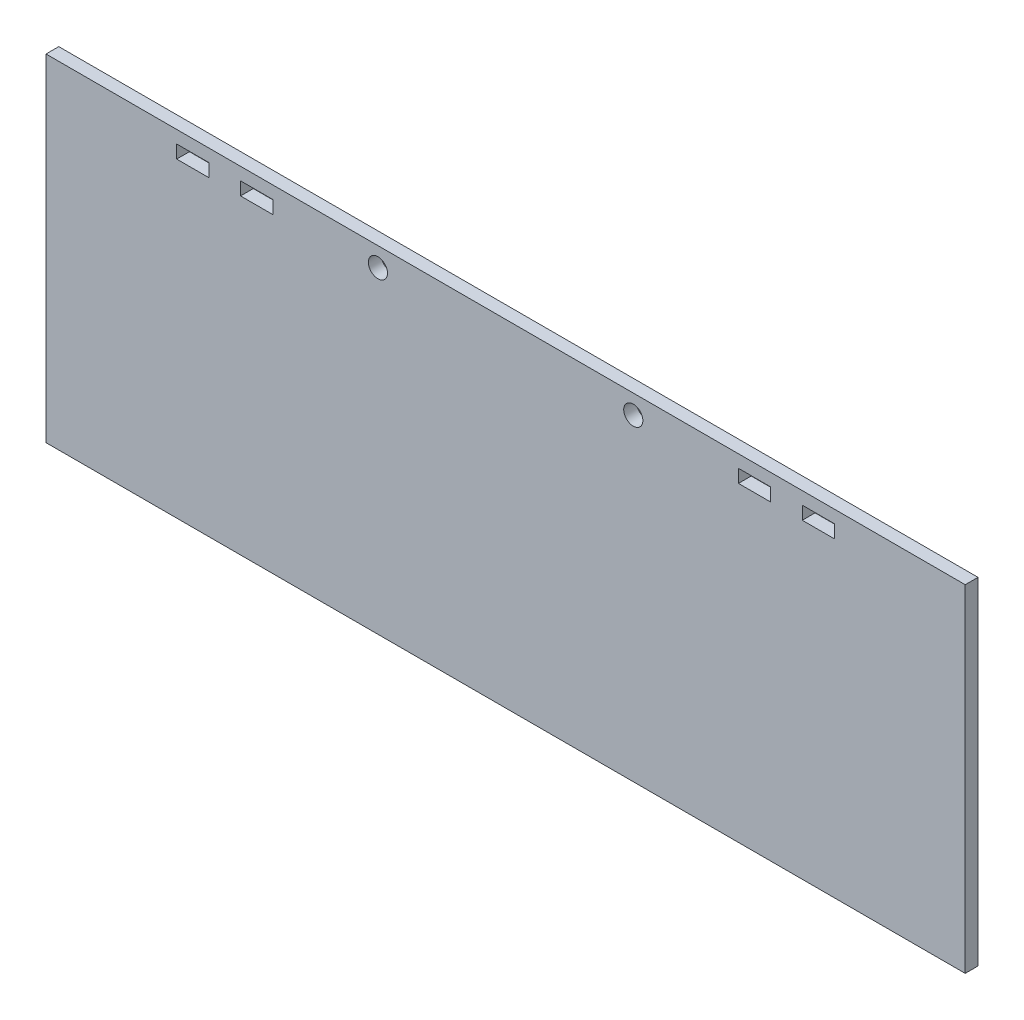
ISO-10303-21;
HEADER;
FILE_DESCRIPTION(('STEP AP214'),'2;1');
FILE_NAME('part.step','',(''),(''),'','','');
FILE_SCHEMA(('AUTOMOTIVE_DESIGN { 1 0 10303 214 1 1 1 1 }'));
ENDSEC;
DATA;
#1=APPLICATION_CONTEXT('core data for automotive mechanical design processes');
#2=APPLICATION_PROTOCOL_DEFINITION('international standard','automotive_design',2000,#1);
#3=PRODUCT_CONTEXT('',#1,'mechanical');
#4=PRODUCT('Part','Part','',(#3));
#5=PRODUCT_RELATED_PRODUCT_CATEGORY('part','',(#4));
#6=PRODUCT_DEFINITION_FORMATION('','',#4);
#7=PRODUCT_DEFINITION_CONTEXT('part definition',#1,'design');
#8=PRODUCT_DEFINITION('design','',#6,#7);
#9=PRODUCT_DEFINITION_SHAPE('','',#8);
#10=(LENGTH_UNIT() NAMED_UNIT(*) SI_UNIT(.MILLI.,.METRE.));
#11=(NAMED_UNIT(*) PLANE_ANGLE_UNIT() SI_UNIT($,.RADIAN.));
#12=(NAMED_UNIT(*) SI_UNIT($,.STERADIAN.) SOLID_ANGLE_UNIT());
#13=UNCERTAINTY_MEASURE_WITH_UNIT(LENGTH_MEASURE(1.E-05),#10,'distance_accuracy_value','');
#14=(GEOMETRIC_REPRESENTATION_CONTEXT(3) GLOBAL_UNCERTAINTY_ASSIGNED_CONTEXT((#13)) GLOBAL_UNIT_ASSIGNED_CONTEXT((#10,
#11,#12)) REPRESENTATION_CONTEXT('',''));
#15=CARTESIAN_POINT('',(0.,0.,0.));
#16=DIRECTION('',(0.,0.,1.));
#17=DIRECTION('',(1.,0.,0.));
#18=AXIS2_PLACEMENT_3D('',#15,#16,#17);
#19=CARTESIAN_POINT('',(0.,0.,2.));
#20=DIRECTION('',(0.,0.,1.));
#21=DIRECTION('',(1.,0.,0.));
#22=AXIS2_PLACEMENT_3D('',#19,#20,#21);
#23=PLANE('',#22);
#24=DIRECTION('',(-1.,0.,0.));
#25=VECTOR('',#24,1.);
#26=CARTESIAN_POINT('',(95.8,0.,2.));
#27=LINE('',#26,#25);
#28=CARTESIAN_POINT('',(95.8,0.,2.));
#29=VERTEX_POINT('',#28);
#30=CARTESIAN_POINT('',(90.75,0.,2.));
#31=VERTEX_POINT('',#30);
#32=EDGE_CURVE('E181',#29,#31,#27,.T.);
#33=ORIENTED_EDGE('',*,*,#32,.F.);
#34=DIRECTION('',(0.,1.,0.));
#35=VECTOR('',#34,1.);
#36=CARTESIAN_POINT('',(95.8,0.,2.));
#37=LINE('',#36,#35);
#38=CARTESIAN_POINT('',(95.8,-2.04999999999999,2.));
#39=VERTEX_POINT('',#38);
#40=EDGE_CURVE('E173',#39,#29,#37,.T.);
#41=ORIENTED_EDGE('',*,*,#40,.F.);
#42=DIRECTION('',(1.,0.,0.));
#43=VECTOR('',#42,1.);
#44=CARTESIAN_POINT('',(95.8,-2.04999999999999,2.));
#45=LINE('',#44,#43);
#46=CARTESIAN_POINT('',(90.75,-2.04999999999999,2.));
#47=VERTEX_POINT('',#46);
#48=EDGE_CURVE('E196',#47,#39,#45,.T.);
#49=ORIENTED_EDGE('',*,*,#48,.F.);
#50=DIRECTION('',(0.,-1.,0.));
#51=VECTOR('',#50,1.);
#52=CARTESIAN_POINT('',(90.75,0.,2.));
#53=LINE('',#52,#51);
#54=EDGE_CURVE('E194',#31,#47,#53,.T.);
#55=ORIENTED_EDGE('',*,*,#54,.F.);
#56=EDGE_LOOP('',(#33,#41,#49,#55));
#57=FACE_BOUND('',#56,.T.);
#58=CARTESIAN_POINT('',(34.275,-1.02499999999999,2.));
#59=DIRECTION('',(0.,0.,1.));
#60=DIRECTION('',(1.,0.,0.));
#61=AXIS2_PLACEMENT_3D('',#58,#59,#60);
#62=CIRCLE('',#61,1.5);
#63=CARTESIAN_POINT('',(35.775,-1.02499999999999,2.));
#64=VERTEX_POINT('',#63);
#65=EDGE_CURVE('E212',#64,#64,#62,.T.);
#66=ORIENTED_EDGE('',*,*,#65,.F.);
#67=EDGE_LOOP('',(#66));
#68=FACE_BOUND('',#67,.T.);
#69=DIRECTION('',(-1.,0.,0.));
#70=VECTOR('',#69,1.);
#71=CARTESIAN_POINT('',(54.2768532390721,1.97309279806744,2.));
#72=LINE('',#71,#70);
#73=CARTESIAN_POINT('',(126.276853239072,1.97309279806744,2.));
#74=VERTEX_POINT('',#73);
#75=CARTESIAN_POINT('',(-17.7231467609279,1.97309279806744,2.));
#76=VERTEX_POINT('',#75);
#77=EDGE_CURVE('E311',#74,#76,#72,.T.);
#78=ORIENTED_EDGE('',*,*,#77,.T.);
#79=DIRECTION('',(0.,-1.,0.));
#80=VECTOR('',#79,1.);
#81=CARTESIAN_POINT('',(-17.7231467609279,1.97309279806744,2.));
#82=LINE('',#81,#80);
#83=CARTESIAN_POINT('',(-17.7231467609279,-50.7609146083273,2.));
#84=VERTEX_POINT('',#83);
#85=EDGE_CURVE('E314',#76,#84,#82,.T.);
#86=ORIENTED_EDGE('',*,*,#85,.T.);
#87=DIRECTION('',(1.,0.,0.));
#88=VECTOR('',#87,1.);
#89=CARTESIAN_POINT('',(-17.7231467609279,-50.7609146083273,2.));
#90=LINE('',#89,#88);
#91=CARTESIAN_POINT('',(126.276853239072,-50.7609146083273,2.));
#92=VERTEX_POINT('',#91);
#93=EDGE_CURVE('E317',#84,#92,#90,.T.);
#94=ORIENTED_EDGE('',*,*,#93,.T.);
#95=DIRECTION('',(0.,1.,0.));
#96=VECTOR('',#95,1.);
#97=CARTESIAN_POINT('',(126.276853239072,1.97309279806744,2.));
#98=LINE('',#97,#96);
#99=EDGE_CURVE('E319',#92,#74,#98,.T.);
#100=ORIENTED_EDGE('',*,*,#99,.T.);
#101=EDGE_LOOP('',(#78,#86,#94,#100));
#102=FACE_BOUND('',#101,.T.);
#103=DIRECTION('',(-1.,0.,0.));
#104=VECTOR('',#103,1.);
#105=CARTESIAN_POINT('',(2.75000000000001,0.,2.));
#106=LINE('',#105,#104);
#107=CARTESIAN_POINT('',(7.80000000000001,0.,2.));
#108=VERTEX_POINT('',#107);
#109=CARTESIAN_POINT('',(2.75000000000001,0.,2.));
#110=VERTEX_POINT('',#109);
#111=EDGE_CURVE('E282',#108,#110,#106,.T.);
#112=ORIENTED_EDGE('',*,*,#111,.F.);
#113=DIRECTION('',(0.,1.,0.));
#114=VECTOR('',#113,1.);
#115=CARTESIAN_POINT('',(7.80000000000001,0.,2.));
#116=LINE('',#115,#114);
#117=CARTESIAN_POINT('',(7.80000000000001,-2.04999999999999,2.));
#118=VERTEX_POINT('',#117);
#119=EDGE_CURVE('E280',#118,#108,#116,.T.);
#120=ORIENTED_EDGE('',*,*,#119,.F.);
#121=DIRECTION('',(1.,0.,0.));
#122=VECTOR('',#121,1.);
#123=CARTESIAN_POINT('',(2.75000000000001,-2.04999999999999,2.));
#124=LINE('',#123,#122);
#125=CARTESIAN_POINT('',(2.75000000000001,-2.04999999999999,2.));
#126=VERTEX_POINT('',#125);
#127=EDGE_CURVE('E288',#126,#118,#124,.T.);
#128=ORIENTED_EDGE('',*,*,#127,.F.);
#129=DIRECTION('',(0.,-1.,0.));
#130=VECTOR('',#129,1.);
#131=CARTESIAN_POINT('',(2.75000000000001,0.,2.));
#132=LINE('',#131,#130);
#133=EDGE_CURVE('E285',#110,#126,#132,.T.);
#134=ORIENTED_EDGE('',*,*,#133,.F.);
#135=EDGE_LOOP('',(#112,#120,#128,#134));
#136=FACE_BOUND('',#135,.T.);
#137=DIRECTION('',(-1.,0.,0.));
#138=VECTOR('',#137,1.);
#139=CARTESIAN_POINT('',(12.75,0.,2.));
#140=LINE('',#139,#138);
#141=CARTESIAN_POINT('',(17.8,0.,2.));
#142=VERTEX_POINT('',#141);
#143=CARTESIAN_POINT('',(12.75,0.,2.));
#144=VERTEX_POINT('',#143);
#145=EDGE_CURVE('E251',#142,#144,#140,.T.);
#146=ORIENTED_EDGE('',*,*,#145,.F.);
#147=DIRECTION('',(0.,1.,0.));
#148=VECTOR('',#147,1.);
#149=CARTESIAN_POINT('',(17.8,0.,2.));
#150=LINE('',#149,#148);
#151=CARTESIAN_POINT('',(17.8,-2.04999999999999,2.));
#152=VERTEX_POINT('',#151);
#153=EDGE_CURVE('E249',#152,#142,#150,.T.);
#154=ORIENTED_EDGE('',*,*,#153,.F.);
#155=DIRECTION('',(1.,0.,0.));
#156=VECTOR('',#155,1.);
#157=CARTESIAN_POINT('',(12.75,-2.04999999999999,2.));
#158=LINE('',#157,#156);
#159=CARTESIAN_POINT('',(12.75,-2.04999999999999,2.));
#160=VERTEX_POINT('',#159);
#161=EDGE_CURVE('E257',#160,#152,#158,.T.);
#162=ORIENTED_EDGE('',*,*,#161,.F.);
#163=DIRECTION('',(0.,-1.,0.));
#164=VECTOR('',#163,1.);
#165=CARTESIAN_POINT('',(12.75,0.,2.));
#166=LINE('',#165,#164);
#167=EDGE_CURVE('E254',#144,#160,#166,.T.);
#168=ORIENTED_EDGE('',*,*,#167,.F.);
#169=EDGE_LOOP('',(#146,#154,#162,#168));
#170=FACE_BOUND('',#169,.T.);
#171=DIRECTION('',(-1.,0.,0.));
#172=VECTOR('',#171,1.);
#173=CARTESIAN_POINT('',(105.8,0.,2.));
#174=LINE('',#173,#172);
#175=CARTESIAN_POINT('',(105.8,0.,2.));
#176=VERTEX_POINT('',#175);
#177=CARTESIAN_POINT('',(100.75,0.,2.));
#178=VERTEX_POINT('',#177);
#179=EDGE_CURVE('E220',#176,#178,#174,.T.);
#180=ORIENTED_EDGE('',*,*,#179,.F.);
#181=DIRECTION('',(0.,1.,0.));
#182=VECTOR('',#181,1.);
#183=CARTESIAN_POINT('',(105.8,0.,2.));
#184=LINE('',#183,#182);
#185=CARTESIAN_POINT('',(105.8,-2.04999999999999,2.));
#186=VERTEX_POINT('',#185);
#187=EDGE_CURVE('E218',#186,#176,#184,.T.);
#188=ORIENTED_EDGE('',*,*,#187,.F.);
#189=DIRECTION('',(1.,0.,0.));
#190=VECTOR('',#189,1.);
#191=CARTESIAN_POINT('',(105.8,-2.04999999999999,2.));
#192=LINE('',#191,#190);
#193=CARTESIAN_POINT('',(100.75,-2.04999999999999,2.));
#194=VERTEX_POINT('',#193);
#195=EDGE_CURVE('E226',#194,#186,#192,.T.);
#196=ORIENTED_EDGE('',*,*,#195,.F.);
#197=DIRECTION('',(0.,-1.,0.));
#198=VECTOR('',#197,1.);
#199=CARTESIAN_POINT('',(100.75,0.,2.));
#200=LINE('',#199,#198);
#201=EDGE_CURVE('E223',#178,#194,#200,.T.);
#202=ORIENTED_EDGE('',*,*,#201,.F.);
#203=EDGE_LOOP('',(#180,#188,#196,#202));
#204=FACE_BOUND('',#203,.T.);
#205=CARTESIAN_POINT('',(74.275,-1.02499999999999,2.));
#206=DIRECTION('',(0.,0.,1.));
#207=DIRECTION('',(1.,0.,0.));
#208=AXIS2_PLACEMENT_3D('',#205,#206,#207);
#209=CIRCLE('',#208,1.5);
#210=CARTESIAN_POINT('',(75.775,-1.02499999999999,2.));
#211=VERTEX_POINT('',#210);
#212=EDGE_CURVE('E202',#211,#211,#209,.T.);
#213=ORIENTED_EDGE('',*,*,#212,.F.);
#214=EDGE_LOOP('',(#213));
#215=FACE_BOUND('',#214,.T.);
#216=ADVANCED_FACE('F36',(#57,#68,#102,#136,#170,#204,#215),#23,.T.);
#217=CARTESIAN_POINT('',(0.,0.,0.));
#218=DIRECTION('',(0.,0.,1.));
#219=DIRECTION('',(1.,0.,0.));
#220=AXIS2_PLACEMENT_3D('',#217,#218,#219);
#221=PLANE('',#220);
#222=CARTESIAN_POINT('',(34.275,-1.02499999999999,0.));
#223=DIRECTION('',(0.,0.,1.));
#224=DIRECTION('',(1.,0.,0.));
#225=AXIS2_PLACEMENT_3D('',#222,#223,#224);
#226=CIRCLE('',#225,1.5);
#227=CARTESIAN_POINT('',(35.775,-1.02499999999999,0.));
#228=VERTEX_POINT('',#227);
#229=EDGE_CURVE('E189',#228,#228,#226,.T.);
#230=ORIENTED_EDGE('',*,*,#229,.T.);
#231=EDGE_LOOP('',(#230));
#232=FACE_BOUND('',#231,.T.);
#233=DIRECTION('',(0.,1.,0.));
#234=VECTOR('',#233,1.);
#235=CARTESIAN_POINT('',(105.8,0.,0.));
#236=LINE('',#235,#234);
#237=CARTESIAN_POINT('',(105.8,-2.04999999999999,0.));
#238=VERTEX_POINT('',#237);
#239=CARTESIAN_POINT('',(105.8,0.,0.));
#240=VERTEX_POINT('',#239);
#241=EDGE_CURVE('E215',#238,#240,#236,.T.);
#242=ORIENTED_EDGE('',*,*,#241,.T.);
#243=DIRECTION('',(-1.,0.,0.));
#244=VECTOR('',#243,1.);
#245=CARTESIAN_POINT('',(105.8,0.,0.));
#246=LINE('',#245,#244);
#247=CARTESIAN_POINT('',(100.75,0.,0.));
#248=VERTEX_POINT('',#247);
#249=EDGE_CURVE('E231',#240,#248,#246,.T.);
#250=ORIENTED_EDGE('',*,*,#249,.T.);
#251=DIRECTION('',(0.,-1.,0.));
#252=VECTOR('',#251,1.);
#253=CARTESIAN_POINT('',(100.75,0.,0.));
#254=LINE('',#253,#252);
#255=CARTESIAN_POINT('',(100.75,-2.04999999999999,0.));
#256=VERTEX_POINT('',#255);
#257=EDGE_CURVE('E234',#248,#256,#254,.T.);
#258=ORIENTED_EDGE('',*,*,#257,.T.);
#259=DIRECTION('',(1.,0.,0.));
#260=VECTOR('',#259,1.);
#261=CARTESIAN_POINT('',(105.8,-2.04999999999999,0.));
#262=LINE('',#261,#260);
#263=EDGE_CURVE('E221',#256,#238,#262,.T.);
#264=ORIENTED_EDGE('',*,*,#263,.T.);
#265=EDGE_LOOP('',(#242,#250,#258,#264));
#266=FACE_BOUND('',#265,.T.);
#267=DIRECTION('',(0.,1.,0.));
#268=VECTOR('',#267,1.);
#269=CARTESIAN_POINT('',(7.80000000000001,0.,0.));
#270=LINE('',#269,#268);
#271=CARTESIAN_POINT('',(7.80000000000001,-2.04999999999999,0.));
#272=VERTEX_POINT('',#271);
#273=CARTESIAN_POINT('',(7.80000000000001,0.,0.));
#274=VERTEX_POINT('',#273);
#275=EDGE_CURVE('E279',#272,#274,#270,.T.);
#276=ORIENTED_EDGE('',*,*,#275,.T.);
#277=DIRECTION('',(-1.,0.,0.));
#278=VECTOR('',#277,1.);
#279=CARTESIAN_POINT('',(2.75000000000001,0.,0.));
#280=LINE('',#279,#278);
#281=CARTESIAN_POINT('',(2.75000000000001,0.,0.));
#282=VERTEX_POINT('',#281);
#283=EDGE_CURVE('E293',#274,#282,#280,.T.);
#284=ORIENTED_EDGE('',*,*,#283,.T.);
#285=DIRECTION('',(0.,-1.,0.));
#286=VECTOR('',#285,1.);
#287=CARTESIAN_POINT('',(2.75000000000001,0.,0.));
#288=LINE('',#287,#286);
#289=CARTESIAN_POINT('',(2.75000000000001,-2.04999999999999,0.));
#290=VERTEX_POINT('',#289);
#291=EDGE_CURVE('E296',#282,#290,#288,.T.);
#292=ORIENTED_EDGE('',*,*,#291,.T.);
#293=DIRECTION('',(1.,0.,0.));
#294=VECTOR('',#293,1.);
#295=CARTESIAN_POINT('',(2.75000000000001,-2.04999999999999,0.));
#296=LINE('',#295,#294);
#297=EDGE_CURVE('E283',#290,#272,#296,.T.);
#298=ORIENTED_EDGE('',*,*,#297,.T.);
#299=EDGE_LOOP('',(#276,#284,#292,#298));
#300=FACE_BOUND('',#299,.T.);
#301=DIRECTION('',(0.,-1.,0.));
#302=VECTOR('',#301,1.);
#303=CARTESIAN_POINT('',(-17.7231467609279,1.97309279806744,0.));
#304=LINE('',#303,#302);
#305=CARTESIAN_POINT('',(-17.7231467609279,1.97309279806744,0.));
#306=VERTEX_POINT('',#305);
#307=CARTESIAN_POINT('',(-17.7231467609279,-50.7609146083273,0.));
#308=VERTEX_POINT('',#307);
#309=EDGE_CURVE('E310',#306,#308,#304,.T.);
#310=ORIENTED_EDGE('',*,*,#309,.F.);
#311=DIRECTION('',(-1.,0.,0.));
#312=VECTOR('',#311,1.);
#313=CARTESIAN_POINT('',(54.2768532390721,1.97309279806744,0.));
#314=LINE('',#313,#312);
#315=CARTESIAN_POINT('',(126.276853239072,1.97309279806744,0.));
#316=VERTEX_POINT('',#315);
#317=EDGE_CURVE('E315',#316,#306,#314,.T.);
#318=ORIENTED_EDGE('',*,*,#317,.F.);
#319=DIRECTION('',(0.,1.,0.));
#320=VECTOR('',#319,1.);
#321=CARTESIAN_POINT('',(126.276853239072,1.97309279806744,0.));
#322=LINE('',#321,#320);
#323=CARTESIAN_POINT('',(126.276853239072,-50.7609146083273,0.));
#324=VERTEX_POINT('',#323);
#325=EDGE_CURVE('E326',#324,#316,#322,.T.);
#326=ORIENTED_EDGE('',*,*,#325,.F.);
#327=DIRECTION('',(1.,0.,0.));
#328=VECTOR('',#327,1.);
#329=CARTESIAN_POINT('',(-17.7231467609279,-50.7609146083273,0.));
#330=LINE('',#329,#328);
#331=EDGE_CURVE('E324',#308,#324,#330,.T.);
#332=ORIENTED_EDGE('',*,*,#331,.F.);
#333=EDGE_LOOP('',(#310,#318,#326,#332));
#334=FACE_BOUND('',#333,.T.);
#335=DIRECTION('',(0.,1.,0.));
#336=VECTOR('',#335,1.);
#337=CARTESIAN_POINT('',(17.8,0.,0.));
#338=LINE('',#337,#336);
#339=CARTESIAN_POINT('',(17.8,-2.04999999999999,0.));
#340=VERTEX_POINT('',#339);
#341=CARTESIAN_POINT('',(17.8,0.,0.));
#342=VERTEX_POINT('',#341);
#343=EDGE_CURVE('E248',#340,#342,#338,.T.);
#344=ORIENTED_EDGE('',*,*,#343,.T.);
#345=DIRECTION('',(-1.,0.,0.));
#346=VECTOR('',#345,1.);
#347=CARTESIAN_POINT('',(12.75,0.,0.));
#348=LINE('',#347,#346);
#349=CARTESIAN_POINT('',(12.75,0.,0.));
#350=VERTEX_POINT('',#349);
#351=EDGE_CURVE('E262',#342,#350,#348,.T.);
#352=ORIENTED_EDGE('',*,*,#351,.T.);
#353=DIRECTION('',(0.,-1.,0.));
#354=VECTOR('',#353,1.);
#355=CARTESIAN_POINT('',(12.75,0.,0.));
#356=LINE('',#355,#354);
#357=CARTESIAN_POINT('',(12.75,-2.04999999999999,0.));
#358=VERTEX_POINT('',#357);
#359=EDGE_CURVE('E265',#350,#358,#356,.T.);
#360=ORIENTED_EDGE('',*,*,#359,.T.);
#361=DIRECTION('',(1.,0.,0.));
#362=VECTOR('',#361,1.);
#363=CARTESIAN_POINT('',(12.75,-2.04999999999999,0.));
#364=LINE('',#363,#362);
#365=EDGE_CURVE('E252',#358,#340,#364,.T.);
#366=ORIENTED_EDGE('',*,*,#365,.T.);
#367=EDGE_LOOP('',(#344,#352,#360,#366));
#368=FACE_BOUND('',#367,.T.);
#369=DIRECTION('',(0.,1.,0.));
#370=VECTOR('',#369,1.);
#371=CARTESIAN_POINT('',(95.8,0.,0.));
#372=LINE('',#371,#370);
#373=CARTESIAN_POINT('',(95.8,-2.04999999999999,0.));
#374=VERTEX_POINT('',#373);
#375=CARTESIAN_POINT('',(95.8,0.,0.));
#376=VERTEX_POINT('',#375);
#377=EDGE_CURVE('E59',#374,#376,#372,.T.);
#378=ORIENTED_EDGE('',*,*,#377,.T.);
#379=DIRECTION('',(-1.,0.,0.));
#380=VECTOR('',#379,1.);
#381=CARTESIAN_POINT('',(95.8,0.,0.));
#382=LINE('',#381,#380);
#383=CARTESIAN_POINT('',(90.75,0.,0.));
#384=VERTEX_POINT('',#383);
#385=EDGE_CURVE('E188',#376,#384,#382,.T.);
#386=ORIENTED_EDGE('',*,*,#385,.T.);
#387=DIRECTION('',(0.,-1.,0.));
#388=VECTOR('',#387,1.);
#389=CARTESIAN_POINT('',(90.75,0.,0.));
#390=LINE('',#389,#388);
#391=CARTESIAN_POINT('',(90.75,-2.04999999999999,0.));
#392=VERTEX_POINT('',#391);
#393=EDGE_CURVE('E204',#384,#392,#390,.T.);
#394=ORIENTED_EDGE('',*,*,#393,.T.);
#395=DIRECTION('',(1.,0.,0.));
#396=VECTOR('',#395,1.);
#397=CARTESIAN_POINT('',(95.8,-2.04999999999999,0.));
#398=LINE('',#397,#396);
#399=EDGE_CURVE('E182',#392,#374,#398,.T.);
#400=ORIENTED_EDGE('',*,*,#399,.T.);
#401=EDGE_LOOP('',(#378,#386,#394,#400));
#402=FACE_BOUND('',#401,.T.);
#403=CARTESIAN_POINT('',(74.275,-1.02499999999999,0.));
#404=DIRECTION('',(0.,0.,1.));
#405=DIRECTION('',(1.,0.,0.));
#406=AXIS2_PLACEMENT_3D('',#403,#404,#405);
#407=CIRCLE('',#406,1.5);
#408=CARTESIAN_POINT('',(75.775,-1.02499999999999,0.));
#409=VERTEX_POINT('',#408);
#410=EDGE_CURVE('E586',#409,#409,#407,.T.);
#411=ORIENTED_EDGE('',*,*,#410,.T.);
#412=EDGE_LOOP('',(#411));
#413=FACE_BOUND('',#412,.T.);
#414=ADVANCED_FACE('F344',(#232,#266,#300,#334,#368,#402,#413),#221,.F.);
#415=CARTESIAN_POINT('',(-17.7231467609279,1.97309279806744,2.));
#416=DIRECTION('',(1.,0.,0.));
#417=DIRECTION('',(0.,1.,0.));
#418=AXIS2_PLACEMENT_3D('',#415,#416,#417);
#419=PLANE('',#418);
#420=ORIENTED_EDGE('',*,*,#309,.T.);
#421=DIRECTION('',(0.,0.,-1.));
#422=VECTOR('',#421,1.);
#423=CARTESIAN_POINT('',(-17.7231467609279,-50.7609146083273,2.));
#424=LINE('',#423,#422);
#425=EDGE_CURVE('E44',#84,#308,#424,.T.);
#426=ORIENTED_EDGE('',*,*,#425,.F.);
#427=ORIENTED_EDGE('',*,*,#85,.F.);
#428=DIRECTION('',(0.,0.,-1.));
#429=VECTOR('',#428,1.);
#430=CARTESIAN_POINT('',(-17.7231467609279,1.97309279806744,2.));
#431=LINE('',#430,#429);
#432=EDGE_CURVE('E11',#76,#306,#431,.T.);
#433=ORIENTED_EDGE('',*,*,#432,.T.);
#434=EDGE_LOOP('',(#420,#426,#427,#433));
#435=FACE_BOUND('',#434,.T.);
#436=ADVANCED_FACE('F38',(#435),#419,.F.);
#437=CARTESIAN_POINT('',(-17.7231467609279,-50.7609146083273,2.));
#438=DIRECTION('',(0.,1.,0.));
#439=DIRECTION('',(0.,0.,1.));
#440=AXIS2_PLACEMENT_3D('',#437,#438,#439);
#441=PLANE('',#440);
#442=ORIENTED_EDGE('',*,*,#331,.T.);
#443=DIRECTION('',(0.,0.,-1.));
#444=VECTOR('',#443,1.);
#445=CARTESIAN_POINT('',(126.276853239072,-50.7609146083273,2.));
#446=LINE('',#445,#444);
#447=EDGE_CURVE('E331',#92,#324,#446,.T.);
#448=ORIENTED_EDGE('',*,*,#447,.F.);
#449=ORIENTED_EDGE('',*,*,#93,.F.);
#450=ORIENTED_EDGE('',*,*,#425,.T.);
#451=EDGE_LOOP('',(#442,#448,#449,#450));
#452=FACE_BOUND('',#451,.T.);
#453=ADVANCED_FACE('F338',(#452),#441,.F.);
#454=CARTESIAN_POINT('',(126.276853239072,1.97309279806744,2.));
#455=DIRECTION('',(-1.,0.,0.));
#456=DIRECTION('',(0.,0.,1.));
#457=AXIS2_PLACEMENT_3D('',#454,#455,#456);
#458=PLANE('',#457);
#459=ORIENTED_EDGE('',*,*,#325,.T.);
#460=DIRECTION('',(0.,0.,-1.));
#461=VECTOR('',#460,1.);
#462=CARTESIAN_POINT('',(126.276853239072,1.97309279806744,2.));
#463=LINE('',#462,#461);
#464=EDGE_CURVE('E322',#74,#316,#463,.T.);
#465=ORIENTED_EDGE('',*,*,#464,.F.);
#466=ORIENTED_EDGE('',*,*,#99,.F.);
#467=ORIENTED_EDGE('',*,*,#447,.T.);
#468=EDGE_LOOP('',(#459,#465,#466,#467));
#469=FACE_BOUND('',#468,.T.);
#470=ADVANCED_FACE('F349',(#469),#458,.F.);
#471=CARTESIAN_POINT('',(54.2768532390721,1.97309279806744,2.));
#472=DIRECTION('',(0.,-1.,0.));
#473=DIRECTION('',(0.,0.,-1.));
#474=AXIS2_PLACEMENT_3D('',#471,#472,#473);
#475=PLANE('',#474);
#476=ORIENTED_EDGE('',*,*,#317,.T.);
#477=ORIENTED_EDGE('',*,*,#432,.F.);
#478=ORIENTED_EDGE('',*,*,#77,.F.);
#479=ORIENTED_EDGE('',*,*,#464,.T.);
#480=EDGE_LOOP('',(#476,#477,#478,#479));
#481=FACE_BOUND('',#480,.T.);
#482=ADVANCED_FACE('F352',(#481),#475,.F.);
#483=CARTESIAN_POINT('',(7.80000000000001,0.,2.));
#484=DIRECTION('',(-1.,0.,0.));
#485=DIRECTION('',(0.,0.,1.));
#486=AXIS2_PLACEMENT_3D('',#483,#484,#485);
#487=PLANE('',#486);
#488=ORIENTED_EDGE('',*,*,#275,.F.);
#489=DIRECTION('',(0.,0.,-1.));
#490=VECTOR('',#489,1.);
#491=CARTESIAN_POINT('',(7.80000000000001,-2.04999999999999,2.));
#492=LINE('',#491,#490);
#493=EDGE_CURVE('E290',#118,#272,#492,.T.);
#494=ORIENTED_EDGE('',*,*,#493,.F.);
#495=ORIENTED_EDGE('',*,*,#119,.T.);
#496=DIRECTION('',(0.,0.,-1.));
#497=VECTOR('',#496,1.);
#498=CARTESIAN_POINT('',(7.80000000000001,0.,2.));
#499=LINE('',#498,#497);
#500=EDGE_CURVE('E307',#108,#274,#499,.T.);
#501=ORIENTED_EDGE('',*,*,#500,.T.);
#502=EDGE_LOOP('',(#488,#494,#495,#501));
#503=FACE_BOUND('',#502,.T.);
#504=ADVANCED_FACE('F368',(#503),#487,.T.);
#505=CARTESIAN_POINT('',(2.75000000000001,0.,2.));
#506=DIRECTION('',(0.,-1.,0.));
#507=DIRECTION('',(0.,0.,-1.));
#508=AXIS2_PLACEMENT_3D('',#505,#506,#507);
#509=PLANE('',#508);
#510=ORIENTED_EDGE('',*,*,#283,.F.);
#511=ORIENTED_EDGE('',*,*,#500,.F.);
#512=ORIENTED_EDGE('',*,*,#111,.T.);
#513=DIRECTION('',(0.,0.,-1.));
#514=VECTOR('',#513,1.);
#515=CARTESIAN_POINT('',(2.75000000000001,0.,2.));
#516=LINE('',#515,#514);
#517=EDGE_CURVE('E305',#110,#282,#516,.T.);
#518=ORIENTED_EDGE('',*,*,#517,.T.);
#519=EDGE_LOOP('',(#510,#511,#512,#518));
#520=FACE_BOUND('',#519,.T.);
#521=ADVANCED_FACE('F388',(#520),#509,.T.);
#522=CARTESIAN_POINT('',(2.75000000000001,0.,2.));
#523=DIRECTION('',(1.,0.,0.));
#524=DIRECTION('',(0.,1.,0.));
#525=AXIS2_PLACEMENT_3D('',#522,#523,#524);
#526=PLANE('',#525);
#527=ORIENTED_EDGE('',*,*,#291,.F.);
#528=ORIENTED_EDGE('',*,*,#517,.F.);
#529=ORIENTED_EDGE('',*,*,#133,.T.);
#530=DIRECTION('',(0.,0.,-1.));
#531=VECTOR('',#530,1.);
#532=CARTESIAN_POINT('',(2.75000000000001,-2.04999999999999,2.));
#533=LINE('',#532,#531);
#534=EDGE_CURVE('E303',#126,#290,#533,.T.);
#535=ORIENTED_EDGE('',*,*,#534,.T.);
#536=EDGE_LOOP('',(#527,#528,#529,#535));
#537=FACE_BOUND('',#536,.T.);
#538=ADVANCED_FACE('F395',(#537),#526,.T.);
#539=CARTESIAN_POINT('',(2.75000000000001,-2.04999999999999,2.));
#540=DIRECTION('',(0.,1.,0.));
#541=DIRECTION('',(-1.,0.,0.));
#542=AXIS2_PLACEMENT_3D('',#539,#540,#541);
#543=PLANE('',#542);
#544=ORIENTED_EDGE('',*,*,#297,.F.);
#545=ORIENTED_EDGE('',*,*,#534,.F.);
#546=ORIENTED_EDGE('',*,*,#127,.T.);
#547=ORIENTED_EDGE('',*,*,#493,.T.);
#548=EDGE_LOOP('',(#544,#545,#546,#547));
#549=FACE_BOUND('',#548,.T.);
#550=ADVANCED_FACE('F402',(#549),#543,.T.);
#551=CARTESIAN_POINT('',(17.8,0.,2.));
#552=DIRECTION('',(-1.,0.,0.));
#553=DIRECTION('',(0.,0.,1.));
#554=AXIS2_PLACEMENT_3D('',#551,#552,#553);
#555=PLANE('',#554);
#556=ORIENTED_EDGE('',*,*,#343,.F.);
#557=DIRECTION('',(0.,0.,-1.));
#558=VECTOR('',#557,1.);
#559=CARTESIAN_POINT('',(17.8,-2.04999999999999,2.));
#560=LINE('',#559,#558);
#561=EDGE_CURVE('E259',#152,#340,#560,.T.);
#562=ORIENTED_EDGE('',*,*,#561,.F.);
#563=ORIENTED_EDGE('',*,*,#153,.T.);
#564=DIRECTION('',(0.,0.,-1.));
#565=VECTOR('',#564,1.);
#566=CARTESIAN_POINT('',(17.8,0.,2.));
#567=LINE('',#566,#565);
#568=EDGE_CURVE('E276',#142,#342,#567,.T.);
#569=ORIENTED_EDGE('',*,*,#568,.T.);
#570=EDGE_LOOP('',(#556,#562,#563,#569));
#571=FACE_BOUND('',#570,.T.);
#572=ADVANCED_FACE('F410',(#571),#555,.T.);
#573=CARTESIAN_POINT('',(12.75,0.,2.));
#574=DIRECTION('',(0.,-1.,0.));
#575=DIRECTION('',(0.,0.,-1.));
#576=AXIS2_PLACEMENT_3D('',#573,#574,#575);
#577=PLANE('',#576);
#578=ORIENTED_EDGE('',*,*,#351,.F.);
#579=ORIENTED_EDGE('',*,*,#568,.F.);
#580=ORIENTED_EDGE('',*,*,#145,.T.);
#581=DIRECTION('',(0.,0.,-1.));
#582=VECTOR('',#581,1.);
#583=CARTESIAN_POINT('',(12.75,0.,2.));
#584=LINE('',#583,#582);
#585=EDGE_CURVE('E274',#144,#350,#584,.T.);
#586=ORIENTED_EDGE('',*,*,#585,.T.);
#587=EDGE_LOOP('',(#578,#579,#580,#586));
#588=FACE_BOUND('',#587,.T.);
#589=ADVANCED_FACE('F418',(#588),#577,.T.);
#590=CARTESIAN_POINT('',(12.75,0.,2.));
#591=DIRECTION('',(1.,0.,0.));
#592=DIRECTION('',(0.,0.,-1.));
#593=AXIS2_PLACEMENT_3D('',#590,#591,#592);
#594=PLANE('',#593);
#595=ORIENTED_EDGE('',*,*,#359,.F.);
#596=ORIENTED_EDGE('',*,*,#585,.F.);
#597=ORIENTED_EDGE('',*,*,#167,.T.);
#598=DIRECTION('',(0.,0.,-1.));
#599=VECTOR('',#598,1.);
#600=CARTESIAN_POINT('',(12.75,-2.04999999999999,2.));
#601=LINE('',#600,#599);
#602=EDGE_CURVE('E272',#160,#358,#601,.T.);
#603=ORIENTED_EDGE('',*,*,#602,.T.);
#604=EDGE_LOOP('',(#595,#596,#597,#603));
#605=FACE_BOUND('',#604,.T.);
#606=ADVANCED_FACE('F426',(#605),#594,.T.);
#607=CARTESIAN_POINT('',(12.75,-2.04999999999999,2.));
#608=DIRECTION('',(0.,1.,0.));
#609=DIRECTION('',(0.,0.,1.));
#610=AXIS2_PLACEMENT_3D('',#607,#608,#609);
#611=PLANE('',#610);
#612=ORIENTED_EDGE('',*,*,#365,.F.);
#613=ORIENTED_EDGE('',*,*,#602,.F.);
#614=ORIENTED_EDGE('',*,*,#161,.T.);
#615=ORIENTED_EDGE('',*,*,#561,.T.);
#616=EDGE_LOOP('',(#612,#613,#614,#615));
#617=FACE_BOUND('',#616,.T.);
#618=ADVANCED_FACE('F434',(#617),#611,.T.);
#619=CARTESIAN_POINT('',(105.8,0.,2.));
#620=DIRECTION('',(-1.,0.,0.));
#621=DIRECTION('',(0.,0.,1.));
#622=AXIS2_PLACEMENT_3D('',#619,#620,#621);
#623=PLANE('',#622);
#624=ORIENTED_EDGE('',*,*,#241,.F.);
#625=DIRECTION('',(0.,0.,-1.));
#626=VECTOR('',#625,1.);
#627=CARTESIAN_POINT('',(105.8,-2.04999999999999,2.));
#628=LINE('',#627,#626);
#629=EDGE_CURVE('E228',#186,#238,#628,.T.);
#630=ORIENTED_EDGE('',*,*,#629,.F.);
#631=ORIENTED_EDGE('',*,*,#187,.T.);
#632=DIRECTION('',(0.,0.,-1.));
#633=VECTOR('',#632,1.);
#634=CARTESIAN_POINT('',(105.8,0.,2.));
#635=LINE('',#634,#633);
#636=EDGE_CURVE('E245',#176,#240,#635,.T.);
#637=ORIENTED_EDGE('',*,*,#636,.T.);
#638=EDGE_LOOP('',(#624,#630,#631,#637));
#639=FACE_BOUND('',#638,.T.);
#640=ADVANCED_FACE('F442',(#639),#623,.T.);
#641=CARTESIAN_POINT('',(105.8,0.,2.));
#642=DIRECTION('',(0.,-1.,0.));
#643=DIRECTION('',(0.,0.,-1.));
#644=AXIS2_PLACEMENT_3D('',#641,#642,#643);
#645=PLANE('',#644);
#646=ORIENTED_EDGE('',*,*,#249,.F.);
#647=ORIENTED_EDGE('',*,*,#636,.F.);
#648=ORIENTED_EDGE('',*,*,#179,.T.);
#649=DIRECTION('',(0.,0.,-1.));
#650=VECTOR('',#649,1.);
#651=CARTESIAN_POINT('',(100.75,0.,2.));
#652=LINE('',#651,#650);
#653=EDGE_CURVE('E243',#178,#248,#652,.T.);
#654=ORIENTED_EDGE('',*,*,#653,.T.);
#655=EDGE_LOOP('',(#646,#647,#648,#654));
#656=FACE_BOUND('',#655,.T.);
#657=ADVANCED_FACE('F450',(#656),#645,.T.);
#658=CARTESIAN_POINT('',(100.75,0.,2.));
#659=DIRECTION('',(1.,0.,0.));
#660=DIRECTION('',(0.,0.,-1.));
#661=AXIS2_PLACEMENT_3D('',#658,#659,#660);
#662=PLANE('',#661);
#663=ORIENTED_EDGE('',*,*,#257,.F.);
#664=ORIENTED_EDGE('',*,*,#653,.F.);
#665=ORIENTED_EDGE('',*,*,#201,.T.);
#666=DIRECTION('',(0.,0.,-1.));
#667=VECTOR('',#666,1.);
#668=CARTESIAN_POINT('',(100.75,-2.04999999999999,2.));
#669=LINE('',#668,#667);
#670=EDGE_CURVE('E241',#194,#256,#669,.T.);
#671=ORIENTED_EDGE('',*,*,#670,.T.);
#672=EDGE_LOOP('',(#663,#664,#665,#671));
#673=FACE_BOUND('',#672,.T.);
#674=ADVANCED_FACE('F458',(#673),#662,.T.);
#675=CARTESIAN_POINT('',(105.8,-2.04999999999999,2.));
#676=DIRECTION('',(0.,1.,0.));
#677=DIRECTION('',(-1.,0.,0.));
#678=AXIS2_PLACEMENT_3D('',#675,#676,#677);
#679=PLANE('',#678);
#680=ORIENTED_EDGE('',*,*,#263,.F.);
#681=ORIENTED_EDGE('',*,*,#670,.F.);
#682=ORIENTED_EDGE('',*,*,#195,.T.);
#683=ORIENTED_EDGE('',*,*,#629,.T.);
#684=EDGE_LOOP('',(#680,#681,#682,#683));
#685=FACE_BOUND('',#684,.T.);
#686=ADVANCED_FACE('F466',(#685),#679,.T.);
#687=CARTESIAN_POINT('',(34.275,-1.02499999999999,2.));
#688=DIRECTION('',(0.,0.,-1.));
#689=DIRECTION('',(-1.,0.,0.));
#690=AXIS2_PLACEMENT_3D('',#687,#688,#689);
#691=CYLINDRICAL_SURFACE('',#690,1.5);
#692=ORIENTED_EDGE('',*,*,#65,.T.);
#693=EDGE_LOOP('',(#692));
#694=FACE_BOUND('',#693,.T.);
#695=ORIENTED_EDGE('',*,*,#229,.F.);
#696=EDGE_LOOP('',(#695));
#697=FACE_BOUND('',#696,.T.);
#698=ADVANCED_FACE('F474',(#694,#697),#691,.F.);
#699=CARTESIAN_POINT('',(95.8,0.,2.));
#700=DIRECTION('',(-1.,0.,0.));
#701=DIRECTION('',(0.,0.,1.));
#702=AXIS2_PLACEMENT_3D('',#699,#700,#701);
#703=PLANE('',#702);
#704=ORIENTED_EDGE('',*,*,#377,.F.);
#705=DIRECTION('',(0.,0.,-1.));
#706=VECTOR('',#705,1.);
#707=CARTESIAN_POINT('',(95.8,-2.04999999999999,2.));
#708=LINE('',#707,#706);
#709=EDGE_CURVE('E177',#39,#374,#708,.T.);
#710=ORIENTED_EDGE('',*,*,#709,.F.);
#711=ORIENTED_EDGE('',*,*,#40,.T.);
#712=DIRECTION('',(0.,0.,-1.));
#713=VECTOR('',#712,1.);
#714=CARTESIAN_POINT('',(95.8,0.,2.));
#715=LINE('',#714,#713);
#716=EDGE_CURVE('E176',#29,#376,#715,.T.);
#717=ORIENTED_EDGE('',*,*,#716,.T.);
#718=EDGE_LOOP('',(#704,#710,#711,#717));
#719=FACE_BOUND('',#718,.T.);
#720=ADVANCED_FACE('F175',(#719),#703,.T.);
#721=CARTESIAN_POINT('',(95.8,0.,2.));
#722=DIRECTION('',(0.,-1.,0.));
#723=DIRECTION('',(0.,0.,-1.));
#724=AXIS2_PLACEMENT_3D('',#721,#722,#723);
#725=PLANE('',#724);
#726=ORIENTED_EDGE('',*,*,#385,.F.);
#727=ORIENTED_EDGE('',*,*,#716,.F.);
#728=ORIENTED_EDGE('',*,*,#32,.T.);
#729=DIRECTION('',(0.,0.,-1.));
#730=VECTOR('',#729,1.);
#731=CARTESIAN_POINT('',(90.75,0.,2.));
#732=LINE('',#731,#730);
#733=EDGE_CURVE('E190',#31,#384,#732,.T.);
#734=ORIENTED_EDGE('',*,*,#733,.T.);
#735=EDGE_LOOP('',(#726,#727,#728,#734));
#736=FACE_BOUND('',#735,.T.);
#737=ADVANCED_FACE('F185',(#736),#725,.T.);
#738=CARTESIAN_POINT('',(90.75,0.,2.));
#739=DIRECTION('',(1.,0.,0.));
#740=DIRECTION('',(0.,0.,-1.));
#741=AXIS2_PLACEMENT_3D('',#738,#739,#740);
#742=PLANE('',#741);
#743=ORIENTED_EDGE('',*,*,#393,.F.);
#744=ORIENTED_EDGE('',*,*,#733,.F.);
#745=ORIENTED_EDGE('',*,*,#54,.T.);
#746=DIRECTION('',(0.,0.,-1.));
#747=VECTOR('',#746,1.);
#748=CARTESIAN_POINT('',(90.75,-2.04999999999999,2.));
#749=LINE('',#748,#747);
#750=EDGE_CURVE('E51',#47,#392,#749,.T.);
#751=ORIENTED_EDGE('',*,*,#750,.T.);
#752=EDGE_LOOP('',(#743,#744,#745,#751));
#753=FACE_BOUND('',#752,.T.);
#754=ADVANCED_FACE('F495',(#753),#742,.T.);
#755=CARTESIAN_POINT('',(95.8,-2.04999999999999,2.));
#756=DIRECTION('',(0.,1.,0.));
#757=DIRECTION('',(0.,0.,1.));
#758=AXIS2_PLACEMENT_3D('',#755,#756,#757);
#759=PLANE('',#758);
#760=ORIENTED_EDGE('',*,*,#399,.F.);
#761=ORIENTED_EDGE('',*,*,#750,.F.);
#762=ORIENTED_EDGE('',*,*,#48,.T.);
#763=ORIENTED_EDGE('',*,*,#709,.T.);
#764=EDGE_LOOP('',(#760,#761,#762,#763));
#765=FACE_BOUND('',#764,.T.);
#766=ADVANCED_FACE('F502',(#765),#759,.T.);
#767=CARTESIAN_POINT('',(74.275,-1.02499999999999,2.));
#768=DIRECTION('',(0.,0.,-1.));
#769=DIRECTION('',(-1.,0.,0.));
#770=AXIS2_PLACEMENT_3D('',#767,#768,#769);
#771=CYLINDRICAL_SURFACE('',#770,1.5);
#772=ORIENTED_EDGE('',*,*,#212,.T.);
#773=EDGE_LOOP('',(#772));
#774=FACE_BOUND('',#773,.T.);
#775=ORIENTED_EDGE('',*,*,#410,.F.);
#776=EDGE_LOOP('',(#775));
#777=FACE_BOUND('',#776,.T.);
#778=ADVANCED_FACE('F510',(#774,#777),#771,.F.);
#779=CLOSED_SHELL('',(#216,#414,#436,#453,#470,#482,#504,#521,#538,#550,#572,#589,#606,#618,
#640,#657,#674,#686,#698,#720,#737,#754,#766,#778));
#780=MANIFOLD_SOLID_BREP('B2',#779);
#781=ADVANCED_BREP_SHAPE_REPRESENTATION('',(#18,#780),#14);
#782=SHAPE_DEFINITION_REPRESENTATION(#9,#781);
ENDSEC;
END-ISO-10303-21;
